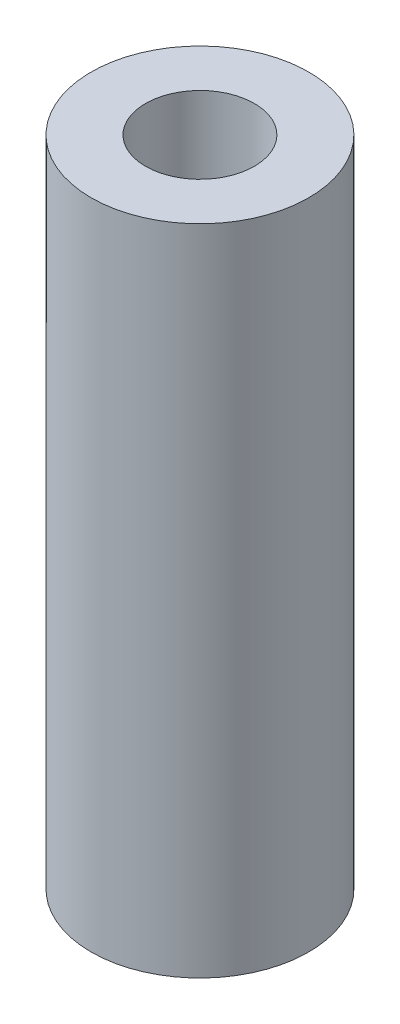
ISO-10303-21;
HEADER;
FILE_DESCRIPTION(('STEP AP214'),'2;1');
FILE_NAME('part.step','',(''),(''),'','','');
FILE_SCHEMA(('AUTOMOTIVE_DESIGN { 1 0 10303 214 1 1 1 1 }'));
ENDSEC;
DATA;
#1=APPLICATION_CONTEXT('core data for automotive mechanical design processes');
#2=APPLICATION_PROTOCOL_DEFINITION('international standard','automotive_design',2000,#1);
#3=PRODUCT_CONTEXT('',#1,'mechanical');
#4=PRODUCT('Part','Part','',(#3));
#5=PRODUCT_RELATED_PRODUCT_CATEGORY('part','',(#4));
#6=PRODUCT_DEFINITION_FORMATION('','',#4);
#7=PRODUCT_DEFINITION_CONTEXT('part definition',#1,'design');
#8=PRODUCT_DEFINITION('design','',#6,#7);
#9=PRODUCT_DEFINITION_SHAPE('','',#8);
#10=(LENGTH_UNIT() NAMED_UNIT(*) SI_UNIT(.MILLI.,.METRE.));
#11=(NAMED_UNIT(*) PLANE_ANGLE_UNIT() SI_UNIT($,.RADIAN.));
#12=(NAMED_UNIT(*) SI_UNIT($,.STERADIAN.) SOLID_ANGLE_UNIT());
#13=UNCERTAINTY_MEASURE_WITH_UNIT(LENGTH_MEASURE(1.E-05),#10,'distance_accuracy_value','');
#14=(GEOMETRIC_REPRESENTATION_CONTEXT(3) GLOBAL_UNCERTAINTY_ASSIGNED_CONTEXT((#13)) GLOBAL_UNIT_ASSIGNED_CONTEXT((#10,
#11,#12)) REPRESENTATION_CONTEXT('',''));
#15=CARTESIAN_POINT('',(0.,0.,0.));
#16=DIRECTION('',(0.,0.,1.));
#17=DIRECTION('',(1.,0.,0.));
#18=AXIS2_PLACEMENT_3D('',#15,#16,#17);
#19=CARTESIAN_POINT('',(0.,30.,0.));
#20=DIRECTION('',(0.,1.,0.));
#21=DIRECTION('',(0.,0.,1.));
#22=AXIS2_PLACEMENT_3D('',#19,#20,#21);
#23=PLANE('',#22);
#24=CARTESIAN_POINT('',(0.,30.,0.));
#25=DIRECTION('',(0.,1.,0.));
#26=DIRECTION('',(0.,0.,1.));
#27=AXIS2_PLACEMENT_3D('',#24,#25,#26);
#28=CIRCLE('',#27,5.);
#29=CARTESIAN_POINT('',(0.,30.,5.));
#30=VERTEX_POINT('',#29);
#31=EDGE_CURVE('E10',#30,#30,#28,.T.);
#32=ORIENTED_EDGE('',*,*,#31,.T.);
#33=EDGE_LOOP('',(#32));
#34=FACE_BOUND('',#33,.T.);
#35=CARTESIAN_POINT('',(0.,30.,0.));
#36=DIRECTION('',(0.,1.,0.));
#37=DIRECTION('',(0.,0.,1.));
#38=AXIS2_PLACEMENT_3D('',#35,#36,#37);
#39=CIRCLE('',#38,2.5);
#40=CARTESIAN_POINT('',(0.,30.,2.5));
#41=VERTEX_POINT('',#40);
#42=EDGE_CURVE('E50',#41,#41,#39,.T.);
#43=ORIENTED_EDGE('',*,*,#42,.F.);
#44=EDGE_LOOP('',(#43));
#45=FACE_BOUND('',#44,.T.);
#46=ADVANCED_FACE('F37',(#34,#45),#23,.T.);
#47=CARTESIAN_POINT('',(0.,0.,0.));
#48=DIRECTION('',(0.,1.,0.));
#49=DIRECTION('',(0.,0.,1.));
#50=AXIS2_PLACEMENT_3D('',#47,#48,#49);
#51=PLANE('',#50);
#52=CARTESIAN_POINT('',(0.,0.,0.));
#53=DIRECTION('',(0.,1.,0.));
#54=DIRECTION('',(0.,0.,1.));
#55=AXIS2_PLACEMENT_3D('',#52,#53,#54);
#56=CIRCLE('',#55,5.);
#57=CARTESIAN_POINT('',(0.,0.,5.));
#58=VERTEX_POINT('',#57);
#59=EDGE_CURVE('E41',#58,#58,#56,.T.);
#60=ORIENTED_EDGE('',*,*,#59,.F.);
#61=EDGE_LOOP('',(#60));
#62=FACE_BOUND('',#61,.T.);
#63=CARTESIAN_POINT('',(0.,0.,0.));
#64=DIRECTION('',(0.,1.,0.));
#65=DIRECTION('',(0.,0.,1.));
#66=AXIS2_PLACEMENT_3D('',#63,#64,#65);
#67=CIRCLE('',#66,2.5);
#68=CARTESIAN_POINT('',(0.,0.,2.5));
#69=VERTEX_POINT('',#68);
#70=EDGE_CURVE('E52',#69,#69,#67,.T.);
#71=ORIENTED_EDGE('',*,*,#70,.T.);
#72=EDGE_LOOP('',(#71));
#73=FACE_BOUND('',#72,.T.);
#74=ADVANCED_FACE('F64',(#62,#73),#51,.F.);
#75=CARTESIAN_POINT('',(0.,30.,0.));
#76=DIRECTION('',(0.,-1.,0.));
#77=DIRECTION('',(0.,0.,-1.));
#78=AXIS2_PLACEMENT_3D('',#75,#76,#77);
#79=CYLINDRICAL_SURFACE('',#78,5.);
#80=ORIENTED_EDGE('',*,*,#31,.F.);
#81=EDGE_LOOP('',(#80));
#82=FACE_BOUND('',#81,.T.);
#83=ORIENTED_EDGE('',*,*,#59,.T.);
#84=EDGE_LOOP('',(#83));
#85=FACE_BOUND('',#84,.T.);
#86=ADVANCED_FACE('F39',(#82,#85),#79,.T.);
#87=CARTESIAN_POINT('',(0.,30.,0.));
#88=DIRECTION('',(0.,-1.,0.));
#89=DIRECTION('',(0.,0.,-1.));
#90=AXIS2_PLACEMENT_3D('',#87,#88,#89);
#91=CYLINDRICAL_SURFACE('',#90,2.5);
#92=ORIENTED_EDGE('',*,*,#42,.T.);
#93=EDGE_LOOP('',(#92));
#94=FACE_BOUND('',#93,.T.);
#95=ORIENTED_EDGE('',*,*,#70,.F.);
#96=EDGE_LOOP('',(#95));
#97=FACE_BOUND('',#96,.T.);
#98=ADVANCED_FACE('F60',(#94,#97),#91,.F.);
#99=CLOSED_SHELL('',(#46,#74,#86,#98));
#100=MANIFOLD_SOLID_BREP('B2',#99);
#101=ADVANCED_BREP_SHAPE_REPRESENTATION('',(#18,#100),#14);
#102=SHAPE_DEFINITION_REPRESENTATION(#9,#101);
ENDSEC;
END-ISO-10303-21;
